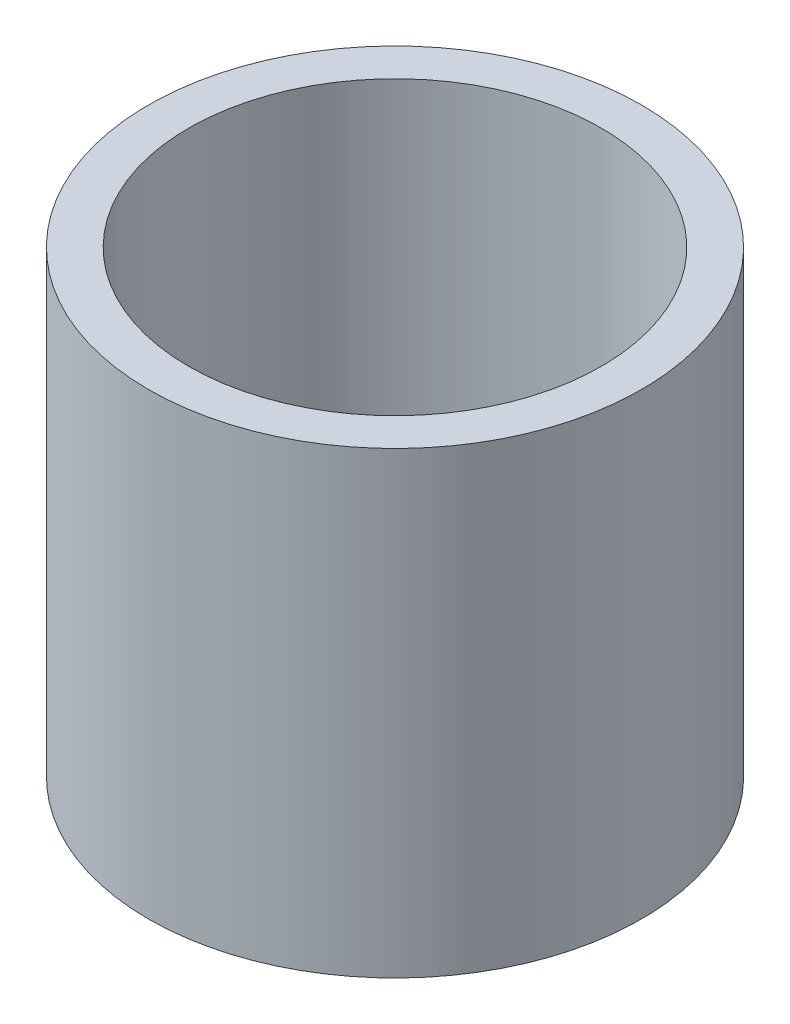
ISO-10303-21;
HEADER;
FILE_DESCRIPTION(('STEP AP214'),'2;1');
FILE_NAME('part.step','',(''),(''),'','','');
FILE_SCHEMA(('AUTOMOTIVE_DESIGN { 1 0 10303 214 1 1 1 1 }'));
ENDSEC;
DATA;
#1=APPLICATION_CONTEXT('core data for automotive mechanical design processes');
#2=APPLICATION_PROTOCOL_DEFINITION('international standard','automotive_design',2000,#1);
#3=PRODUCT_CONTEXT('',#1,'mechanical');
#4=PRODUCT('Part','Part','',(#3));
#5=PRODUCT_RELATED_PRODUCT_CATEGORY('part','',(#4));
#6=PRODUCT_DEFINITION_FORMATION('','',#4);
#7=PRODUCT_DEFINITION_CONTEXT('part definition',#1,'design');
#8=PRODUCT_DEFINITION('design','',#6,#7);
#9=PRODUCT_DEFINITION_SHAPE('','',#8);
#10=(LENGTH_UNIT() NAMED_UNIT(*) SI_UNIT(.MILLI.,.METRE.));
#11=(NAMED_UNIT(*) PLANE_ANGLE_UNIT() SI_UNIT($,.RADIAN.));
#12=(NAMED_UNIT(*) SI_UNIT($,.STERADIAN.) SOLID_ANGLE_UNIT());
#13=UNCERTAINTY_MEASURE_WITH_UNIT(LENGTH_MEASURE(1.E-05),#10,'distance_accuracy_value','');
#14=(GEOMETRIC_REPRESENTATION_CONTEXT(3) GLOBAL_UNCERTAINTY_ASSIGNED_CONTEXT((#13)) GLOBAL_UNIT_ASSIGNED_CONTEXT((#10,
#11,#12)) REPRESENTATION_CONTEXT('',''));
#15=CARTESIAN_POINT('',(0.,0.,0.));
#16=DIRECTION('',(0.,0.,1.));
#17=DIRECTION('',(1.,0.,0.));
#18=AXIS2_PLACEMENT_3D('',#15,#16,#17);
#19=CARTESIAN_POINT('',(0.,4.,0.));
#20=DIRECTION('',(0.,-1.,0.));
#21=DIRECTION('',(0.,0.,-1.));
#22=AXIS2_PLACEMENT_3D('',#19,#20,#21);
#23=CYLINDRICAL_SURFACE('',#22,2.15);
#24=CARTESIAN_POINT('',(0.,4.,0.));
#25=DIRECTION('',(0.,1.,0.));
#26=DIRECTION('',(0.,0.,1.));
#27=AXIS2_PLACEMENT_3D('',#24,#25,#26);
#28=CIRCLE('',#27,2.15);
#29=CARTESIAN_POINT('',(0.,4.,2.15));
#30=VERTEX_POINT('',#29);
#31=EDGE_CURVE('E10',#30,#30,#28,.T.);
#32=ORIENTED_EDGE('',*,*,#31,.F.);
#33=EDGE_LOOP('',(#32));
#34=FACE_BOUND('',#33,.T.);
#35=CARTESIAN_POINT('',(0.,0.,0.));
#36=DIRECTION('',(0.,1.,0.));
#37=DIRECTION('',(0.,0.,1.));
#38=AXIS2_PLACEMENT_3D('',#35,#36,#37);
#39=CIRCLE('',#38,2.15);
#40=CARTESIAN_POINT('',(0.,0.,2.15));
#41=VERTEX_POINT('',#40);
#42=EDGE_CURVE('E34',#41,#41,#39,.T.);
#43=ORIENTED_EDGE('',*,*,#42,.T.);
#44=EDGE_LOOP('',(#43));
#45=FACE_BOUND('',#44,.T.);
#46=ADVANCED_FACE('F31',(#34,#45),#23,.T.);
#47=CARTESIAN_POINT('',(0.,4.,0.));
#48=DIRECTION('',(0.,1.,0.));
#49=DIRECTION('',(0.,0.,1.));
#50=AXIS2_PLACEMENT_3D('',#47,#48,#49);
#51=PLANE('',#50);
#52=CARTESIAN_POINT('',(0.,4.,0.));
#53=DIRECTION('',(0.,1.,0.));
#54=DIRECTION('',(0.,0.,1.));
#55=AXIS2_PLACEMENT_3D('',#52,#53,#54);
#56=CIRCLE('',#55,1.8);
#57=CARTESIAN_POINT('',(0.,4.,1.8));
#58=VERTEX_POINT('',#57);
#59=EDGE_CURVE('E45',#58,#58,#56,.T.);
#60=ORIENTED_EDGE('',*,*,#59,.F.);
#61=EDGE_LOOP('',(#60));
#62=FACE_BOUND('',#61,.T.);
#63=ORIENTED_EDGE('',*,*,#31,.T.);
#64=EDGE_LOOP('',(#63));
#65=FACE_BOUND('',#64,.T.);
#66=ADVANCED_FACE('F51',(#62,#65),#51,.T.);
#67=CARTESIAN_POINT('',(0.,0.,0.));
#68=DIRECTION('',(0.,1.,0.));
#69=DIRECTION('',(0.,0.,1.));
#70=AXIS2_PLACEMENT_3D('',#67,#68,#69);
#71=PLANE('',#70);
#72=CARTESIAN_POINT('',(0.,0.,0.));
#73=DIRECTION('',(0.,1.,0.));
#74=DIRECTION('',(0.,0.,1.));
#75=AXIS2_PLACEMENT_3D('',#72,#73,#74);
#76=CIRCLE('',#75,1.8);
#77=CARTESIAN_POINT('',(0.,0.,1.8));
#78=VERTEX_POINT('',#77);
#79=EDGE_CURVE('E41',#78,#78,#76,.T.);
#80=ORIENTED_EDGE('',*,*,#79,.T.);
#81=EDGE_LOOP('',(#80));
#82=FACE_BOUND('',#81,.T.);
#83=ORIENTED_EDGE('',*,*,#42,.F.);
#84=EDGE_LOOP('',(#83));
#85=FACE_BOUND('',#84,.T.);
#86=ADVANCED_FACE('F53',(#82,#85),#71,.F.);
#87=CARTESIAN_POINT('',(0.,4.,0.));
#88=DIRECTION('',(0.,1.,0.));
#89=DIRECTION('',(0.,0.,1.));
#90=AXIS2_PLACEMENT_3D('',#87,#88,#89);
#91=CYLINDRICAL_SURFACE('',#90,1.8);
#92=ORIENTED_EDGE('',*,*,#79,.F.);
#93=EDGE_LOOP('',(#92));
#94=FACE_BOUND('',#93,.T.);
#95=ORIENTED_EDGE('',*,*,#59,.T.);
#96=EDGE_LOOP('',(#95));
#97=FACE_BOUND('',#96,.T.);
#98=ADVANCED_FACE('F49',(#94,#97),#91,.F.);
#99=CLOSED_SHELL('',(#46,#66,#86,#98));
#100=MANIFOLD_SOLID_BREP('B2',#99);
#101=ADVANCED_BREP_SHAPE_REPRESENTATION('',(#18,#100),#14);
#102=SHAPE_DEFINITION_REPRESENTATION(#9,#101);
ENDSEC;
END-ISO-10303-21;
